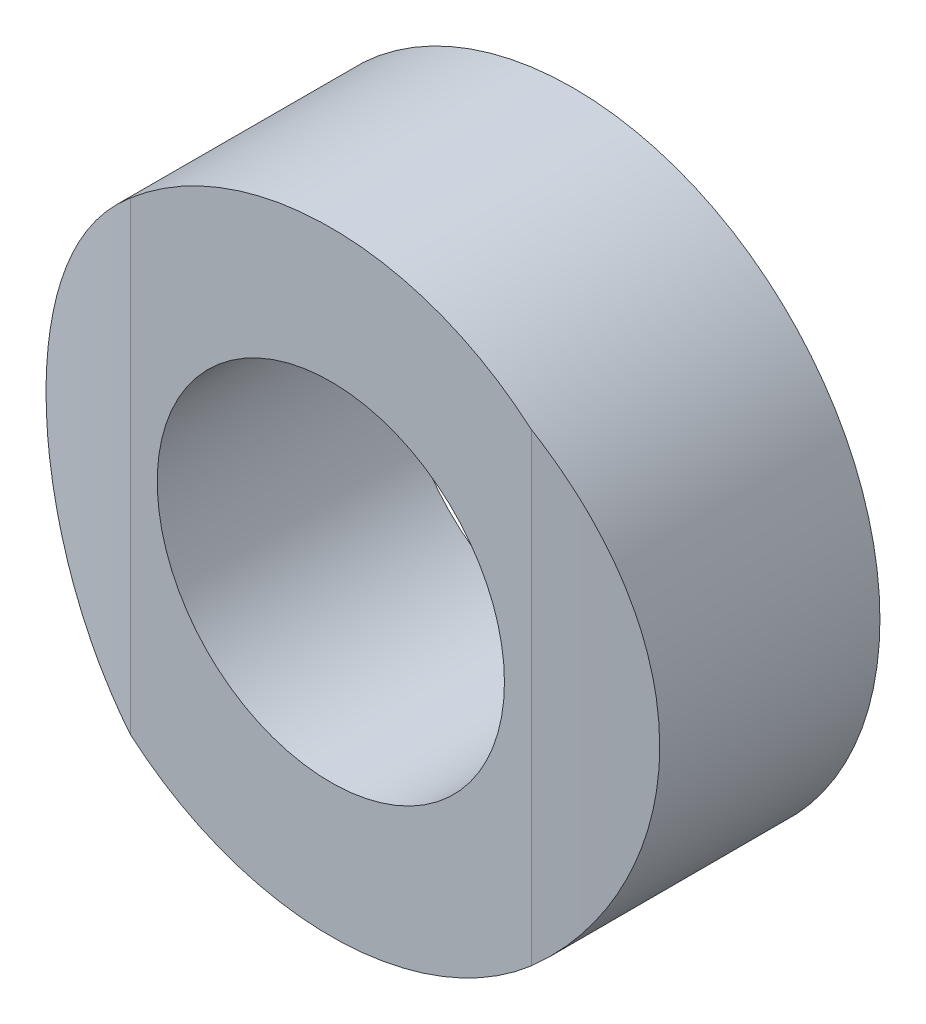
ISO-10303-21;
HEADER;
FILE_DESCRIPTION(('STEP AP214'),'2;1');
FILE_NAME('part.step','',(''),(''),'','','');
FILE_SCHEMA(('AUTOMOTIVE_DESIGN { 1 0 10303 214 1 1 1 1 }'));
ENDSEC;
DATA;
#1=APPLICATION_CONTEXT('core data for automotive mechanical design processes');
#2=APPLICATION_PROTOCOL_DEFINITION('international standard','automotive_design',2000,#1);
#3=PRODUCT_CONTEXT('',#1,'mechanical');
#4=PRODUCT('Part','Part','',(#3));
#5=PRODUCT_RELATED_PRODUCT_CATEGORY('part','',(#4));
#6=PRODUCT_DEFINITION_FORMATION('','',#4);
#7=PRODUCT_DEFINITION_CONTEXT('part definition',#1,'design');
#8=PRODUCT_DEFINITION('design','',#6,#7);
#9=PRODUCT_DEFINITION_SHAPE('','',#8);
#10=(LENGTH_UNIT() NAMED_UNIT(*) SI_UNIT(.MILLI.,.METRE.));
#11=(NAMED_UNIT(*) PLANE_ANGLE_UNIT() SI_UNIT($,.RADIAN.));
#12=(NAMED_UNIT(*) SI_UNIT($,.STERADIAN.) SOLID_ANGLE_UNIT());
#13=UNCERTAINTY_MEASURE_WITH_UNIT(LENGTH_MEASURE(1.E-05),#10,'distance_accuracy_value','');
#14=(GEOMETRIC_REPRESENTATION_CONTEXT(3) GLOBAL_UNCERTAINTY_ASSIGNED_CONTEXT((#13)) GLOBAL_UNIT_ASSIGNED_CONTEXT((#10,
#11,#12)) REPRESENTATION_CONTEXT('',''));
#15=CARTESIAN_POINT('',(0.,0.,0.));
#16=DIRECTION('',(0.,0.,1.));
#17=DIRECTION('',(1.,0.,0.));
#18=AXIS2_PLACEMENT_3D('',#15,#16,#17);
#19=CARTESIAN_POINT('',(0.,14.8,6.15));
#20=DIRECTION('',(0.,0.,1.));
#21=DIRECTION('',(1.,0.,0.));
#22=AXIS2_PLACEMENT_3D('',#19,#20,#21);
#23=CYLINDRICAL_SURFACE('',#22,1.9);
#24=CARTESIAN_POINT('',(-1.24096736459909,16.2387494569938,7.65));
#25=CARTESIAN_POINT('',(-1.28142547501749,16.2038511225574,7.64343743524569));
#26=CARTESIAN_POINT('',(-1.32038466706196,16.1672714936195,7.63678762851868));
#27=CARTESIAN_POINT('',(-1.39508802541302,16.0909625172536,7.62349441534729));
#28=CARTESIAN_POINT('',(-1.43083213439415,16.0512331136883,7.61685100901911));
#29=CARTESIAN_POINT('',(-1.53288523550185,15.9276762879088,7.59720761458515));
#30=CARTESIAN_POINT('',(-1.59404951289609,15.8394504367636,7.58448860710959));
#31=CARTESIAN_POINT('',(-1.70079162843629,15.6537008739459,7.56127059768939));
#32=CARTESIAN_POINT('',(-1.74635568976689,15.5561690406819,7.55077356111142));
#33=CARTESIAN_POINT('',(-1.82042847920569,15.3545752938865,7.53325941021042));
#34=CARTESIAN_POINT('',(-1.84894824894138,15.2505176562883,7.52624004348955));
#35=CARTESIAN_POINT('',(-1.88764555488455,15.0407639867974,7.51662759092565));
#36=CARTESIAN_POINT('',(-1.89814001515739,14.9351299241643,7.51395806940624));
#37=CARTESIAN_POINT('',(-1.90140667960782,14.7235634677237,7.51313229959776));
#38=CARTESIAN_POINT('',(-1.89417873793167,14.6176310714681,7.51497608845282));
#39=CARTESIAN_POINT('',(-1.86257453462218,14.4106967512654,7.52286967738186));
#40=CARTESIAN_POINT('',(-1.83854234853135,14.3096386627798,7.52883505708908));
#41=CARTESIAN_POINT('',(-1.77445363219149,14.1129658873795,7.5441958270714));
#42=CARTESIAN_POINT('',(-1.73438878477228,14.017354055242,7.55359299741503));
#43=CARTESIAN_POINT('',(-1.63868648053805,13.8326841893268,7.5749351422094));
#44=CARTESIAN_POINT('',(-1.5828152574272,13.7437520518135,7.58691766739885));
#45=CARTESIAN_POINT('',(-1.45738879059374,13.5765200127586,7.61200201479624));
#46=CARTESIAN_POINT('',(-1.38786105855253,13.4981992614764,7.62510155718099));
#47=CARTESIAN_POINT('',(-1.28918246202016,13.4039143951554,7.64205947080589));
#48=CARTESIAN_POINT('',(-1.26533984392498,13.3822671560336,7.64604703975719));
#49=CARTESIAN_POINT('',(-1.24096736459909,13.3612505430062,7.65));
#50=B_SPLINE_CURVE_WITH_KNOTS('',3,(#24,#25,#26,#27,#28,#29,#30,#31,#32,#33,#34,#35,#36,#37,#38,
#39,#40,#41,#42,#43,#44,#45,#46,#47,#48,#49),.UNSPECIFIED.,.F.,.F.,(4,2,2,2,2,2,2,2,2,2,2,2,4),
(0.,0.161395457948421,0.322793793033604,0.645454253789466,0.968398930899923,1.29113417067348,
1.60813462228547,1.92513768279076,2.23583307984761,2.54668986392276,2.86240868540432,
3.17749788186563,3.27480112298473),.UNSPECIFIED.);
#51=CARTESIAN_POINT('',(-1.24096736459909,16.2387494569938,7.65));
#52=VERTEX_POINT('',#51);
#53=CARTESIAN_POINT('',(-1.24096736459909,13.3612505430062,7.65));
#54=VERTEX_POINT('',#53);
#55=EDGE_CURVE('E46',#52,#54,#50,.T.);
#56=ORIENTED_EDGE('',*,*,#55,.F.);
#57=CARTESIAN_POINT('',(0.,14.8,7.65));
#58=DIRECTION('',(0.,0.,1.));
#59=DIRECTION('',(1.,0.,0.));
#60=AXIS2_PLACEMENT_3D('',#57,#58,#59);
#61=CIRCLE('',#60,1.9);
#62=CARTESIAN_POINT('',(1.24096736459909,16.2387494569938,7.65));
#63=VERTEX_POINT('',#62);
#64=EDGE_CURVE('E68',#63,#52,#61,.T.);
#65=ORIENTED_EDGE('',*,*,#64,.F.);
#66=CARTESIAN_POINT('',(1.24096736459909,13.3612505430062,7.65));
#67=CARTESIAN_POINT('',(1.28142547501749,13.3961488774426,7.64343743524569));
#68=CARTESIAN_POINT('',(1.32038466706196,13.4327285063805,7.63678762851868));
#69=CARTESIAN_POINT('',(1.39508802541301,13.5090374827464,7.62349441534729));
#70=CARTESIAN_POINT('',(1.43083213439415,13.5487668863117,7.61685100901911));
#71=CARTESIAN_POINT('',(1.53288523550185,13.6723237120912,7.59720761458515));
#72=CARTESIAN_POINT('',(1.59404951289609,13.7605495632364,7.58448860710959));
#73=CARTESIAN_POINT('',(1.70079162843629,13.9462991260541,7.56127059768939));
#74=CARTESIAN_POINT('',(1.74635568976689,14.0438309593181,7.55077356111142));
#75=CARTESIAN_POINT('',(1.82042847920569,14.2454247061135,7.53325941021042));
#76=CARTESIAN_POINT('',(1.84894824894138,14.3494823437117,7.52624004348955));
#77=CARTESIAN_POINT('',(1.88764555488455,14.5592360132026,7.51662759092565));
#78=CARTESIAN_POINT('',(1.89814001515739,14.6648700758357,7.51395806940624));
#79=CARTESIAN_POINT('',(1.90140667960782,14.8764365322763,7.51313229959776));
#80=CARTESIAN_POINT('',(1.89417873793167,14.9823689285318,7.51497608845282));
#81=CARTESIAN_POINT('',(1.86257453462218,15.1893032487346,7.52286967738186));
#82=CARTESIAN_POINT('',(1.83854234853135,15.2903613372202,7.52883505708908));
#83=CARTESIAN_POINT('',(1.77445363219149,15.4870341126205,7.5441958270714));
#84=CARTESIAN_POINT('',(1.73438878477228,15.582645944758,7.55359299741503));
#85=CARTESIAN_POINT('',(1.63868648053805,15.7673158106732,7.5749351422094));
#86=CARTESIAN_POINT('',(1.5828152574272,15.8562479481865,7.58691766739885));
#87=CARTESIAN_POINT('',(1.45738879059374,16.0234799872414,7.61200201479624));
#88=CARTESIAN_POINT('',(1.38786105855253,16.1018007385236,7.62510155718099));
#89=CARTESIAN_POINT('',(1.28918246202015,16.1960856048446,7.6420594708059));
#90=CARTESIAN_POINT('',(1.26533984392498,16.2177328439664,7.64604703975719));
#91=CARTESIAN_POINT('',(1.24096736459909,16.2387494569938,7.65));
#92=B_SPLINE_CURVE_WITH_KNOTS('',3,(#66,#67,#68,#69,#70,#71,#72,#73,#74,#75,#76,#77,#78,#79,#80,
#81,#82,#83,#84,#85,#86,#87,#88,#89,#90,#91),.UNSPECIFIED.,.F.,.F.,(4,2,2,2,2,2,2,2,2,2,2,2,4),
(0.,0.161395457948421,0.322793793033602,0.645454253789466,0.968398930899923,1.29113417067348,
1.60813462228547,1.92513768279076,2.23583307984761,2.54668986392276,2.86240868540433,
3.17749788186564,3.27480112298474),.UNSPECIFIED.);
#93=CARTESIAN_POINT('',(1.24096736459909,13.3612505430062,7.65));
#94=VERTEX_POINT('',#93);
#95=EDGE_CURVE('E53',#94,#63,#92,.T.);
#96=ORIENTED_EDGE('',*,*,#95,.F.);
#97=EDGE_CURVE('E67',#54,#94,#61,.T.);
#98=ORIENTED_EDGE('',*,*,#97,.F.);
#99=EDGE_LOOP('',(#56,#65,#96,#98));
#100=FACE_BOUND('',#99,.T.);
#101=CARTESIAN_POINT('',(0.,14.8,6.15));
#102=DIRECTION('',(0.,0.,1.));
#103=DIRECTION('',(1.,0.,0.));
#104=AXIS2_PLACEMENT_3D('',#101,#102,#103);
#105=CIRCLE('',#104,1.9);
#106=CARTESIAN_POINT('',(1.9,14.8,6.15));
#107=VERTEX_POINT('',#106);
#108=EDGE_CURVE('E63',#107,#107,#105,.T.);
#109=ORIENTED_EDGE('',*,*,#108,.T.);
#110=EDGE_LOOP('',(#109));
#111=FACE_BOUND('',#110,.T.);
#112=ADVANCED_FACE('F33',(#100,#111),#23,.T.);
#113=CARTESIAN_POINT('',(0.,14.8,6.15));
#114=DIRECTION('',(0.,0.,1.));
#115=DIRECTION('',(1.,0.,0.));
#116=AXIS2_PLACEMENT_3D('',#113,#114,#115);
#117=PLANE('',#116);
#118=CARTESIAN_POINT('',(0.,14.8,6.15));
#119=DIRECTION('',(0.,0.,1.));
#120=DIRECTION('',(1.,0.,0.));
#121=AXIS2_PLACEMENT_3D('',#118,#119,#120);
#122=CIRCLE('',#121,1.075);
#123=CARTESIAN_POINT('',(1.075,14.8,6.15));
#124=VERTEX_POINT('',#123);
#125=EDGE_CURVE('E72',#124,#124,#122,.T.);
#126=ORIENTED_EDGE('',*,*,#125,.T.);
#127=EDGE_LOOP('',(#126));
#128=FACE_BOUND('',#127,.T.);
#129=ORIENTED_EDGE('',*,*,#108,.F.);
#130=EDGE_LOOP('',(#129));
#131=FACE_BOUND('',#130,.T.);
#132=ADVANCED_FACE('F100',(#128,#131),#117,.F.);
#133=CARTESIAN_POINT('',(0.,14.8,7.65));
#134=DIRECTION('',(0.,0.,1.));
#135=DIRECTION('',(1.,0.,0.));
#136=AXIS2_PLACEMENT_3D('',#133,#134,#135);
#137=PLANE('',#136);
#138=DIRECTION('',(0.,-1.,0.));
#139=VECTOR('',#138,1.);
#140=CARTESIAN_POINT('',(-1.24096736459909,47.980877883616,7.65));
#141=LINE('',#140,#139);
#142=EDGE_CURVE('E11',#54,#52,#141,.F.);
#143=ORIENTED_EDGE('',*,*,#142,.F.);
#144=ORIENTED_EDGE('',*,*,#97,.T.);
#145=DIRECTION('',(0.,-1.,0.));
#146=VECTOR('',#145,1.);
#147=CARTESIAN_POINT('',(1.24096736459909,47.980877883616,7.65));
#148=LINE('',#147,#146);
#149=EDGE_CURVE('E41',#63,#94,#148,.T.);
#150=ORIENTED_EDGE('',*,*,#149,.F.);
#151=ORIENTED_EDGE('',*,*,#64,.T.);
#152=EDGE_LOOP('',(#143,#144,#150,#151));
#153=FACE_BOUND('',#152,.T.);
#154=CARTESIAN_POINT('',(0.,14.8,7.65));
#155=DIRECTION('',(0.,0.,1.));
#156=DIRECTION('',(1.,0.,0.));
#157=AXIS2_PLACEMENT_3D('',#154,#155,#156);
#158=CIRCLE('',#157,1.075);
#159=CARTESIAN_POINT('',(1.075,14.8,7.65));
#160=VERTEX_POINT('',#159);
#161=EDGE_CURVE('E75',#160,#160,#158,.T.);
#162=ORIENTED_EDGE('',*,*,#161,.F.);
#163=EDGE_LOOP('',(#162));
#164=FACE_BOUND('',#163,.T.);
#165=ADVANCED_FACE('F70',(#153,#164),#137,.T.);
#166=CARTESIAN_POINT('',(0.,14.8,6.15));
#167=DIRECTION('',(0.,0.,1.));
#168=DIRECTION('',(1.,0.,0.));
#169=AXIS2_PLACEMENT_3D('',#166,#167,#168);
#170=CYLINDRICAL_SURFACE('',#169,1.075);
#171=ORIENTED_EDGE('',*,*,#125,.F.);
#172=EDGE_LOOP('',(#171));
#173=FACE_BOUND('',#172,.T.);
#174=ORIENTED_EDGE('',*,*,#161,.T.);
#175=EDGE_LOOP('',(#174));
#176=FACE_BOUND('',#175,.T.);
#177=ADVANCED_FACE('F95',(#173,#176),#170,.F.);
#178=CARTESIAN_POINT('',(0.,47.980877883616,0.));
#179=DIRECTION('',(0.,-1.,0.));
#180=DIRECTION('',(0.,0.,-1.));
#181=AXIS2_PLACEMENT_3D('',#178,#179,#180);
#182=CYLINDRICAL_SURFACE('',#181,7.75);
#183=ORIENTED_EDGE('',*,*,#95,.T.);
#184=ORIENTED_EDGE('',*,*,#149,.T.);
#185=EDGE_LOOP('',(#183,#184));
#186=FACE_BOUND('',#185,.T.);
#187=ADVANCED_FACE('F58',(#186),#182,.T.);
#188=ORIENTED_EDGE('',*,*,#55,.T.);
#189=ORIENTED_EDGE('',*,*,#142,.T.);
#190=EDGE_LOOP('',(#188,#189));
#191=FACE_BOUND('',#190,.T.);
#192=ADVANCED_FACE('F94',(#191),#182,.T.);
#193=CLOSED_SHELL('',(#112,#132,#165,#177,#187,#192));
#194=MANIFOLD_SOLID_BREP('B2',#193);
#195=ADVANCED_BREP_SHAPE_REPRESENTATION('',(#18,#194),#14);
#196=SHAPE_DEFINITION_REPRESENTATION(#9,#195);
ENDSEC;
END-ISO-10303-21;
